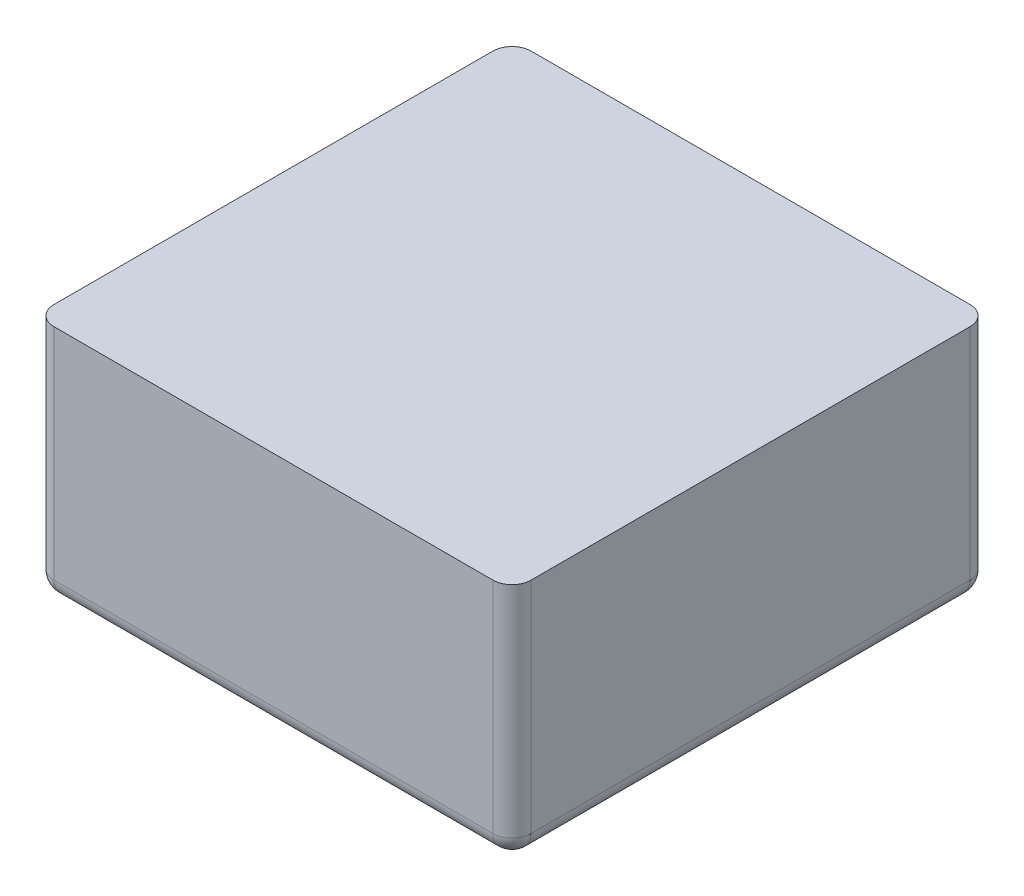
ISO-10303-21;
HEADER;
FILE_DESCRIPTION(('STEP AP214'),'2;1');
FILE_NAME('part.step','',(''),(''),'','','');
FILE_SCHEMA(('AUTOMOTIVE_DESIGN { 1 0 10303 214 1 1 1 1 }'));
ENDSEC;
DATA;
#1=APPLICATION_CONTEXT('core data for automotive mechanical design processes');
#2=APPLICATION_PROTOCOL_DEFINITION('international standard','automotive_design',2000,#1);
#3=PRODUCT_CONTEXT('',#1,'mechanical');
#4=PRODUCT('Part','Part','',(#3));
#5=PRODUCT_RELATED_PRODUCT_CATEGORY('part','',(#4));
#6=PRODUCT_DEFINITION_FORMATION('','',#4);
#7=PRODUCT_DEFINITION_CONTEXT('part definition',#1,'design');
#8=PRODUCT_DEFINITION('design','',#6,#7);
#9=PRODUCT_DEFINITION_SHAPE('','',#8);
#10=(LENGTH_UNIT() NAMED_UNIT(*) SI_UNIT(.MILLI.,.METRE.));
#11=(NAMED_UNIT(*) PLANE_ANGLE_UNIT() SI_UNIT($,.RADIAN.));
#12=(NAMED_UNIT(*) SI_UNIT($,.STERADIAN.) SOLID_ANGLE_UNIT());
#13=UNCERTAINTY_MEASURE_WITH_UNIT(LENGTH_MEASURE(1.E-05),#10,'distance_accuracy_value','');
#14=(GEOMETRIC_REPRESENTATION_CONTEXT(3) GLOBAL_UNCERTAINTY_ASSIGNED_CONTEXT((#13)) GLOBAL_UNIT_ASSIGNED_CONTEXT((#10,
#11,#12)) REPRESENTATION_CONTEXT('',''));
#15=CARTESIAN_POINT('',(0.,0.,0.));
#16=DIRECTION('',(0.,0.,1.));
#17=DIRECTION('',(1.,0.,0.));
#18=AXIS2_PLACEMENT_3D('',#15,#16,#17);
#19=CARTESIAN_POINT('',(-0.25,-0.5,-0.25));
#20=DIRECTION('',(0.,-1.,0.));
#21=DIRECTION('',(0.,0.,-1.));
#22=AXIS2_PLACEMENT_3D('',#19,#20,#21);
#23=PLANE('',#22);
#24=DIRECTION('',(0.,0.,1.));
#25=VECTOR('',#24,1.);
#26=CARTESIAN_POINT('',(0.23,-0.5,-0.25));
#27=LINE('',#26,#25);
#28=CARTESIAN_POINT('',(0.23,-0.5,0.23));
#29=VERTEX_POINT('',#28);
#30=CARTESIAN_POINT('',(0.23,-0.5,-0.23));
#31=VERTEX_POINT('',#30);
#32=EDGE_CURVE('E105',#29,#31,#27,.F.);
#33=ORIENTED_EDGE('',*,*,#32,.F.);
#34=DIRECTION('',(-1.,0.,0.));
#35=VECTOR('',#34,1.);
#36=CARTESIAN_POINT('',(-0.25,-0.5,0.23));
#37=LINE('',#36,#35);
#38=CARTESIAN_POINT('',(-0.23,-0.5,0.23));
#39=VERTEX_POINT('',#38);
#40=EDGE_CURVE('E100',#39,#29,#37,.F.);
#41=ORIENTED_EDGE('',*,*,#40,.F.);
#42=DIRECTION('',(0.,0.,-1.));
#43=VECTOR('',#42,1.);
#44=CARTESIAN_POINT('',(-0.23,-0.5,-0.25));
#45=LINE('',#44,#43);
#46=CARTESIAN_POINT('',(-0.23,-0.5,-0.23));
#47=VERTEX_POINT('',#46);
#48=EDGE_CURVE('E103',#47,#39,#45,.F.);
#49=ORIENTED_EDGE('',*,*,#48,.F.);
#50=DIRECTION('',(1.,0.,0.));
#51=VECTOR('',#50,1.);
#52=CARTESIAN_POINT('',(-0.25,-0.5,-0.23));
#53=LINE('',#52,#51);
#54=EDGE_CURVE('E167',#31,#47,#53,.F.);
#55=ORIENTED_EDGE('',*,*,#54,.F.);
#56=EDGE_LOOP('',(#33,#41,#49,#55));
#57=FACE_BOUND('',#56,.T.);
#58=ADVANCED_FACE('F16',(#57),#23,.T.);
#59=CARTESIAN_POINT('',(0.23,-0.48,0.23));
#60=DIRECTION('',(1.,0.,0.));
#61=DIRECTION('',(0.,1.,0.));
#62=AXIS2_PLACEMENT_3D('',#59,#60,#61);
#63=SPHERICAL_SURFACE('',#62,0.02);
#64=CARTESIAN_POINT('',(0.23,-0.48,0.23));
#65=DIRECTION('',(-1.,0.,0.));
#66=DIRECTION('',(0.,0.,1.));
#67=AXIS2_PLACEMENT_3D('',#64,#65,#66);
#68=CIRCLE('',#67,0.02);
#69=CARTESIAN_POINT('',(0.23,-0.48,0.25));
#70=VERTEX_POINT('',#69);
#71=EDGE_CURVE('E108',#29,#70,#68,.T.);
#72=ORIENTED_EDGE('',*,*,#71,.F.);
#73=CARTESIAN_POINT('',(0.23,-0.48,0.23));
#74=DIRECTION('',(0.,0.,1.));
#75=DIRECTION('',(1.,0.,0.));
#76=AXIS2_PLACEMENT_3D('',#73,#74,#75);
#77=CIRCLE('',#76,0.02);
#78=CARTESIAN_POINT('',(0.25,-0.48,0.23));
#79=VERTEX_POINT('',#78);
#80=EDGE_CURVE('E164',#79,#29,#77,.F.);
#81=ORIENTED_EDGE('',*,*,#80,.F.);
#82=CARTESIAN_POINT('',(0.23,-0.48,0.23));
#83=DIRECTION('',(0.,-1.,0.));
#84=DIRECTION('',(0.,0.,-1.));
#85=AXIS2_PLACEMENT_3D('',#82,#83,#84);
#86=CIRCLE('',#85,0.02);
#87=EDGE_CURVE('E230',#70,#79,#86,.F.);
#88=ORIENTED_EDGE('',*,*,#87,.F.);
#89=EDGE_LOOP('',(#72,#81,#88));
#90=FACE_BOUND('',#89,.T.);
#91=ADVANCED_FACE('F154',(#90),#63,.T.);
#92=CARTESIAN_POINT('',(-0.25,-0.48,0.23));
#93=DIRECTION('',(-1.,0.,0.));
#94=DIRECTION('',(0.,0.,1.));
#95=AXIS2_PLACEMENT_3D('',#92,#93,#94);
#96=CYLINDRICAL_SURFACE('',#95,0.02);
#97=ORIENTED_EDGE('',*,*,#71,.T.);
#98=DIRECTION('',(-1.,0.,0.));
#99=VECTOR('',#98,1.);
#100=CARTESIAN_POINT('',(0.25,-0.48,0.25));
#101=LINE('',#100,#99);
#102=CARTESIAN_POINT('',(-0.23,-0.48,0.25));
#103=VERTEX_POINT('',#102);
#104=EDGE_CURVE('E114',#70,#103,#101,.T.);
#105=ORIENTED_EDGE('',*,*,#104,.T.);
#106=CARTESIAN_POINT('',(-0.23,-0.48,0.23));
#107=DIRECTION('',(1.,0.,0.));
#108=DIRECTION('',(0.,1.,0.));
#109=AXIS2_PLACEMENT_3D('',#106,#107,#108);
#110=CIRCLE('',#109,0.02);
#111=EDGE_CURVE('E111',#39,#103,#110,.F.);
#112=ORIENTED_EDGE('',*,*,#111,.F.);
#113=ORIENTED_EDGE('',*,*,#40,.T.);
#114=EDGE_LOOP('',(#97,#105,#112,#113));
#115=FACE_BOUND('',#114,.T.);
#116=ADVANCED_FACE('F112',(#115),#96,.T.);
#117=CARTESIAN_POINT('',(-0.23,-0.48,0.23));
#118=DIRECTION('',(1.,0.,0.));
#119=DIRECTION('',(0.,1.,0.));
#120=AXIS2_PLACEMENT_3D('',#117,#118,#119);
#121=SPHERICAL_SURFACE('',#120,0.02);
#122=CARTESIAN_POINT('',(-0.23,-0.48,0.23));
#123=DIRECTION('',(0.,-1.,0.));
#124=DIRECTION('',(0.,0.,-1.));
#125=AXIS2_PLACEMENT_3D('',#122,#123,#124);
#126=CIRCLE('',#125,0.02);
#127=CARTESIAN_POINT('',(-0.25,-0.48,0.23));
#128=VERTEX_POINT('',#127);
#129=EDGE_CURVE('E129',#128,#103,#126,.F.);
#130=ORIENTED_EDGE('',*,*,#129,.F.);
#131=CARTESIAN_POINT('',(-0.23,-0.48,0.23));
#132=DIRECTION('',(0.,0.,-1.));
#133=DIRECTION('',(-1.,0.,0.));
#134=AXIS2_PLACEMENT_3D('',#131,#132,#133);
#135=CIRCLE('',#134,0.02);
#136=EDGE_CURVE('E120',#39,#128,#135,.T.);
#137=ORIENTED_EDGE('',*,*,#136,.F.);
#138=ORIENTED_EDGE('',*,*,#111,.T.);
#139=EDGE_LOOP('',(#130,#137,#138));
#140=FACE_BOUND('',#139,.T.);
#141=ADVANCED_FACE('F128',(#140),#121,.T.);
#142=CARTESIAN_POINT('',(-0.23,-0.48,-0.25));
#143=DIRECTION('',(0.,0.,-1.));
#144=DIRECTION('',(-1.,0.,0.));
#145=AXIS2_PLACEMENT_3D('',#142,#143,#144);
#146=CYLINDRICAL_SURFACE('',#145,0.02);
#147=CARTESIAN_POINT('',(-0.23,-0.48,-0.23));
#148=DIRECTION('',(0.,0.,-1.));
#149=DIRECTION('',(1.,0.,0.));
#150=AXIS2_PLACEMENT_3D('',#147,#148,#149);
#151=CIRCLE('',#150,0.02);
#152=CARTESIAN_POINT('',(-0.25,-0.48,-0.23));
#153=VERTEX_POINT('',#152);
#154=EDGE_CURVE('E125',#47,#153,#151,.T.);
#155=ORIENTED_EDGE('',*,*,#154,.F.);
#156=ORIENTED_EDGE('',*,*,#48,.T.);
#157=ORIENTED_EDGE('',*,*,#136,.T.);
#158=DIRECTION('',(0.,0.,-1.));
#159=VECTOR('',#158,1.);
#160=CARTESIAN_POINT('',(-0.25,-0.48,0.25));
#161=LINE('',#160,#159);
#162=EDGE_CURVE('E222',#128,#153,#161,.T.);
#163=ORIENTED_EDGE('',*,*,#162,.T.);
#164=EDGE_LOOP('',(#155,#156,#157,#163));
#165=FACE_BOUND('',#164,.T.);
#166=ADVANCED_FACE('F123',(#165),#146,.T.);
#167=CARTESIAN_POINT('',(-0.23,-0.48,-0.23));
#168=DIRECTION('',(1.,0.,0.));
#169=DIRECTION('',(0.,1.,0.));
#170=AXIS2_PLACEMENT_3D('',#167,#168,#169);
#171=SPHERICAL_SURFACE('',#170,0.02);
#172=CARTESIAN_POINT('',(-0.23,-0.48,-0.23));
#173=DIRECTION('',(0.,-1.,0.));
#174=DIRECTION('',(0.,0.,-1.));
#175=AXIS2_PLACEMENT_3D('',#172,#173,#174);
#176=CIRCLE('',#175,0.02);
#177=CARTESIAN_POINT('',(-0.23,-0.48,-0.25));
#178=VERTEX_POINT('',#177);
#179=EDGE_CURVE('E217',#178,#153,#176,.F.);
#180=ORIENTED_EDGE('',*,*,#179,.F.);
#181=CARTESIAN_POINT('',(-0.23,-0.48,-0.23));
#182=DIRECTION('',(1.,0.,0.));
#183=DIRECTION('',(0.,0.,-1.));
#184=AXIS2_PLACEMENT_3D('',#181,#182,#183);
#185=CIRCLE('',#184,0.02);
#186=EDGE_CURVE('E170',#47,#178,#185,.T.);
#187=ORIENTED_EDGE('',*,*,#186,.F.);
#188=ORIENTED_EDGE('',*,*,#154,.T.);
#189=EDGE_LOOP('',(#180,#187,#188));
#190=FACE_BOUND('',#189,.T.);
#191=ADVANCED_FACE('F266',(#190),#171,.T.);
#192=CARTESIAN_POINT('',(-0.25,-0.48,-0.23));
#193=DIRECTION('',(1.,0.,0.));
#194=DIRECTION('',(0.,0.,-1.));
#195=AXIS2_PLACEMENT_3D('',#192,#193,#194);
#196=CYLINDRICAL_SURFACE('',#195,0.02);
#197=CARTESIAN_POINT('',(0.23,-0.48,-0.23));
#198=DIRECTION('',(1.,0.,0.));
#199=DIRECTION('',(0.,1.,0.));
#200=AXIS2_PLACEMENT_3D('',#197,#198,#199);
#201=CIRCLE('',#200,0.02);
#202=CARTESIAN_POINT('',(0.23,-0.48,-0.25));
#203=VERTEX_POINT('',#202);
#204=EDGE_CURVE('E169',#31,#203,#201,.T.);
#205=ORIENTED_EDGE('',*,*,#204,.F.);
#206=ORIENTED_EDGE('',*,*,#54,.T.);
#207=ORIENTED_EDGE('',*,*,#186,.T.);
#208=DIRECTION('',(1.,0.,0.));
#209=VECTOR('',#208,1.);
#210=CARTESIAN_POINT('',(-0.25,-0.48,-0.25));
#211=LINE('',#210,#209);
#212=EDGE_CURVE('E212',#178,#203,#211,.T.);
#213=ORIENTED_EDGE('',*,*,#212,.T.);
#214=EDGE_LOOP('',(#205,#206,#207,#213));
#215=FACE_BOUND('',#214,.T.);
#216=ADVANCED_FACE('F262',(#215),#196,.T.);
#217=CARTESIAN_POINT('',(0.23,-0.48,-0.23));
#218=DIRECTION('',(1.,0.,0.));
#219=DIRECTION('',(0.,1.,0.));
#220=AXIS2_PLACEMENT_3D('',#217,#218,#219);
#221=SPHERICAL_SURFACE('',#220,0.02);
#222=ORIENTED_EDGE('',*,*,#204,.T.);
#223=CARTESIAN_POINT('',(0.23,-0.48,-0.23));
#224=DIRECTION('',(0.,-1.,0.));
#225=DIRECTION('',(0.,0.,-1.));
#226=AXIS2_PLACEMENT_3D('',#223,#224,#225);
#227=CIRCLE('',#226,0.02);
#228=CARTESIAN_POINT('',(0.25,-0.48,-0.23));
#229=VERTEX_POINT('',#228);
#230=EDGE_CURVE('E206',#229,#203,#227,.F.);
#231=ORIENTED_EDGE('',*,*,#230,.F.);
#232=CARTESIAN_POINT('',(0.23,-0.48,-0.23));
#233=DIRECTION('',(0.,0.,1.));
#234=DIRECTION('',(1.,0.,0.));
#235=AXIS2_PLACEMENT_3D('',#232,#233,#234);
#236=CIRCLE('',#235,0.02);
#237=EDGE_CURVE('E65',#31,#229,#236,.T.);
#238=ORIENTED_EDGE('',*,*,#237,.F.);
#239=EDGE_LOOP('',(#222,#231,#238));
#240=FACE_BOUND('',#239,.T.);
#241=ADVANCED_FACE('F257',(#240),#221,.T.);
#242=CARTESIAN_POINT('',(0.23,-0.48,-0.25));
#243=DIRECTION('',(0.,0.,1.));
#244=DIRECTION('',(1.,0.,0.));
#245=AXIS2_PLACEMENT_3D('',#242,#243,#244);
#246=CYLINDRICAL_SURFACE('',#245,0.02);
#247=ORIENTED_EDGE('',*,*,#237,.T.);
#248=DIRECTION('',(0.,0.,1.));
#249=VECTOR('',#248,1.);
#250=CARTESIAN_POINT('',(0.25,-0.48,-0.25));
#251=LINE('',#250,#249);
#252=EDGE_CURVE('E194',#229,#79,#251,.T.);
#253=ORIENTED_EDGE('',*,*,#252,.T.);
#254=ORIENTED_EDGE('',*,*,#80,.T.);
#255=ORIENTED_EDGE('',*,*,#32,.T.);
#256=EDGE_LOOP('',(#247,#253,#254,#255));
#257=FACE_BOUND('',#256,.T.);
#258=ADVANCED_FACE('F261',(#257),#246,.T.);
#259=CARTESIAN_POINT('',(0.23,-0.5,0.23));
#260=DIRECTION('',(0.,-1.,0.));
#261=DIRECTION('',(0.,0.,-1.));
#262=AXIS2_PLACEMENT_3D('',#259,#260,#261);
#263=CYLINDRICAL_SURFACE('',#262,0.02);
#264=ORIENTED_EDGE('',*,*,#87,.T.);
#265=DIRECTION('',(0.,1.,0.));
#266=VECTOR('',#265,1.);
#267=CARTESIAN_POINT('',(0.25,-0.5,0.23));
#268=LINE('',#267,#266);
#269=CARTESIAN_POINT('',(0.25,-0.25,0.23));
#270=VERTEX_POINT('',#269);
#271=EDGE_CURVE('E198',#79,#270,#268,.T.);
#272=ORIENTED_EDGE('',*,*,#271,.T.);
#273=CARTESIAN_POINT('',(0.23,-0.25,0.23));
#274=DIRECTION('',(0.,-1.,0.));
#275=DIRECTION('',(0.,0.,-1.));
#276=AXIS2_PLACEMENT_3D('',#273,#274,#275);
#277=CIRCLE('',#276,0.02);
#278=CARTESIAN_POINT('',(0.23,-0.25,0.25));
#279=VERTEX_POINT('',#278);
#280=EDGE_CURVE('E19',#270,#279,#277,.T.);
#281=ORIENTED_EDGE('',*,*,#280,.T.);
#282=DIRECTION('',(0.,1.,0.));
#283=VECTOR('',#282,1.);
#284=CARTESIAN_POINT('',(0.23,-0.5,0.25));
#285=LINE('',#284,#283);
#286=EDGE_CURVE('E143',#279,#70,#285,.F.);
#287=ORIENTED_EDGE('',*,*,#286,.T.);
#288=EDGE_LOOP('',(#264,#272,#281,#287));
#289=FACE_BOUND('',#288,.T.);
#290=ADVANCED_FACE('F373',(#289),#263,.T.);
#291=CARTESIAN_POINT('',(0.25,-0.5,0.25));
#292=DIRECTION('',(0.,0.,-1.));
#293=DIRECTION('',(-1.,0.,0.));
#294=AXIS2_PLACEMENT_3D('',#291,#292,#293);
#295=PLANE('',#294);
#296=ORIENTED_EDGE('',*,*,#286,.F.);
#297=DIRECTION('',(1.,0.,0.));
#298=VECTOR('',#297,1.);
#299=CARTESIAN_POINT('',(-0.25,-0.25,0.25));
#300=LINE('',#299,#298);
#301=CARTESIAN_POINT('',(-0.23,-0.25,0.25));
#302=VERTEX_POINT('',#301);
#303=EDGE_CURVE('E185',#279,#302,#300,.F.);
#304=ORIENTED_EDGE('',*,*,#303,.T.);
#305=DIRECTION('',(0.,-1.,0.));
#306=VECTOR('',#305,1.);
#307=CARTESIAN_POINT('',(-0.23,-0.5,0.25));
#308=LINE('',#307,#306);
#309=EDGE_CURVE('E139',#103,#302,#308,.F.);
#310=ORIENTED_EDGE('',*,*,#309,.F.);
#311=ORIENTED_EDGE('',*,*,#104,.F.);
#312=EDGE_LOOP('',(#296,#304,#310,#311));
#313=FACE_BOUND('',#312,.T.);
#314=ADVANCED_FACE('F364',(#313),#295,.F.);
#315=CARTESIAN_POINT('',(-0.23,-0.5,0.23));
#316=DIRECTION('',(0.,-1.,0.));
#317=DIRECTION('',(0.,0.,-1.));
#318=AXIS2_PLACEMENT_3D('',#315,#316,#317);
#319=CYLINDRICAL_SURFACE('',#318,0.02);
#320=CARTESIAN_POINT('',(-0.23,-0.25,0.23));
#321=DIRECTION('',(0.,-1.,0.));
#322=DIRECTION('',(0.,0.,-1.));
#323=AXIS2_PLACEMENT_3D('',#320,#321,#322);
#324=CIRCLE('',#323,0.02);
#325=CARTESIAN_POINT('',(-0.25,-0.25,0.23));
#326=VERTEX_POINT('',#325);
#327=EDGE_CURVE('E183',#302,#326,#324,.T.);
#328=ORIENTED_EDGE('',*,*,#327,.T.);
#329=DIRECTION('',(0.,1.,0.));
#330=VECTOR('',#329,1.);
#331=CARTESIAN_POINT('',(-0.25,-0.5,0.23));
#332=LINE('',#331,#330);
#333=EDGE_CURVE('E220',#326,#128,#332,.F.);
#334=ORIENTED_EDGE('',*,*,#333,.T.);
#335=ORIENTED_EDGE('',*,*,#129,.T.);
#336=ORIENTED_EDGE('',*,*,#309,.T.);
#337=EDGE_LOOP('',(#328,#334,#335,#336));
#338=FACE_BOUND('',#337,.T.);
#339=ADVANCED_FACE('F355',(#338),#319,.T.);
#340=CARTESIAN_POINT('',(-0.25,-0.5,0.25));
#341=DIRECTION('',(1.,0.,0.));
#342=DIRECTION('',(0.,0.,-1.));
#343=AXIS2_PLACEMENT_3D('',#340,#341,#342);
#344=PLANE('',#343);
#345=DIRECTION('',(0.,-1.,0.));
#346=VECTOR('',#345,1.);
#347=CARTESIAN_POINT('',(-0.25,-0.5,-0.23));
#348=LINE('',#347,#346);
#349=CARTESIAN_POINT('',(-0.25,-0.25,-0.23));
#350=VERTEX_POINT('',#349);
#351=EDGE_CURVE('E213',#153,#350,#348,.F.);
#352=ORIENTED_EDGE('',*,*,#351,.F.);
#353=ORIENTED_EDGE('',*,*,#162,.F.);
#354=ORIENTED_EDGE('',*,*,#333,.F.);
#355=DIRECTION('',(0.,0.,-1.));
#356=VECTOR('',#355,1.);
#357=CARTESIAN_POINT('',(-0.25,-0.25,-0.25));
#358=LINE('',#357,#356);
#359=EDGE_CURVE('E182',#326,#350,#358,.T.);
#360=ORIENTED_EDGE('',*,*,#359,.T.);
#361=EDGE_LOOP('',(#352,#353,#354,#360));
#362=FACE_BOUND('',#361,.T.);
#363=ADVANCED_FACE('F287',(#362),#344,.F.);
#364=CARTESIAN_POINT('',(-0.23,-0.5,-0.23));
#365=DIRECTION('',(0.,-1.,0.));
#366=DIRECTION('',(0.,0.,-1.));
#367=AXIS2_PLACEMENT_3D('',#364,#365,#366);
#368=CYLINDRICAL_SURFACE('',#367,0.02);
#369=ORIENTED_EDGE('',*,*,#179,.T.);
#370=ORIENTED_EDGE('',*,*,#351,.T.);
#371=CARTESIAN_POINT('',(-0.23,-0.25,-0.23));
#372=DIRECTION('',(0.,-1.,0.));
#373=DIRECTION('',(0.,0.,-1.));
#374=AXIS2_PLACEMENT_3D('',#371,#372,#373);
#375=CIRCLE('',#374,0.02);
#376=CARTESIAN_POINT('',(-0.23,-0.25,-0.25));
#377=VERTEX_POINT('',#376);
#378=EDGE_CURVE('E180',#350,#377,#375,.T.);
#379=ORIENTED_EDGE('',*,*,#378,.T.);
#380=DIRECTION('',(0.,1.,0.));
#381=VECTOR('',#380,1.);
#382=CARTESIAN_POINT('',(-0.23,-0.5,-0.25));
#383=LINE('',#382,#381);
#384=EDGE_CURVE('E209',#377,#178,#383,.F.);
#385=ORIENTED_EDGE('',*,*,#384,.T.);
#386=EDGE_LOOP('',(#369,#370,#379,#385));
#387=FACE_BOUND('',#386,.T.);
#388=ADVANCED_FACE('F291',(#387),#368,.T.);
#389=CARTESIAN_POINT('',(-0.25,-0.5,-0.25));
#390=DIRECTION('',(0.,0.,1.));
#391=DIRECTION('',(1.,0.,0.));
#392=AXIS2_PLACEMENT_3D('',#389,#390,#391);
#393=PLANE('',#392);
#394=DIRECTION('',(0.,-1.,0.));
#395=VECTOR('',#394,1.);
#396=CARTESIAN_POINT('',(0.23,-0.5,-0.25));
#397=LINE('',#396,#395);
#398=CARTESIAN_POINT('',(0.23,-0.25,-0.25));
#399=VERTEX_POINT('',#398);
#400=EDGE_CURVE('E202',#203,#399,#397,.F.);
#401=ORIENTED_EDGE('',*,*,#400,.F.);
#402=ORIENTED_EDGE('',*,*,#212,.F.);
#403=ORIENTED_EDGE('',*,*,#384,.F.);
#404=DIRECTION('',(1.,0.,0.));
#405=VECTOR('',#404,1.);
#406=CARTESIAN_POINT('',(-0.25,-0.25,-0.25));
#407=LINE('',#406,#405);
#408=EDGE_CURVE('E179',#377,#399,#407,.T.);
#409=ORIENTED_EDGE('',*,*,#408,.T.);
#410=EDGE_LOOP('',(#401,#402,#403,#409));
#411=FACE_BOUND('',#410,.T.);
#412=ADVANCED_FACE('F298',(#411),#393,.F.);
#413=CARTESIAN_POINT('',(0.23,-0.5,-0.23));
#414=DIRECTION('',(0.,-1.,0.));
#415=DIRECTION('',(0.,0.,-1.));
#416=AXIS2_PLACEMENT_3D('',#413,#414,#415);
#417=CYLINDRICAL_SURFACE('',#416,0.02);
#418=CARTESIAN_POINT('',(0.23,-0.25,-0.23));
#419=DIRECTION('',(0.,-1.,0.));
#420=DIRECTION('',(0.,0.,-1.));
#421=AXIS2_PLACEMENT_3D('',#418,#419,#420);
#422=CIRCLE('',#421,0.02);
#423=CARTESIAN_POINT('',(0.25,-0.25,-0.23));
#424=VERTEX_POINT('',#423);
#425=EDGE_CURVE('E25',#399,#424,#422,.T.);
#426=ORIENTED_EDGE('',*,*,#425,.T.);
#427=DIRECTION('',(0.,1.,0.));
#428=VECTOR('',#427,1.);
#429=CARTESIAN_POINT('',(0.25,-0.5,-0.23));
#430=LINE('',#429,#428);
#431=EDGE_CURVE('E33',#424,#229,#430,.F.);
#432=ORIENTED_EDGE('',*,*,#431,.T.);
#433=ORIENTED_EDGE('',*,*,#230,.T.);
#434=ORIENTED_EDGE('',*,*,#400,.T.);
#435=EDGE_LOOP('',(#426,#432,#433,#434));
#436=FACE_BOUND('',#435,.T.);
#437=ADVANCED_FACE('F305',(#436),#417,.T.);
#438=CARTESIAN_POINT('',(0.25,-0.5,-0.25));
#439=DIRECTION('',(-1.,0.,0.));
#440=DIRECTION('',(0.,0.,1.));
#441=AXIS2_PLACEMENT_3D('',#438,#439,#440);
#442=PLANE('',#441);
#443=ORIENTED_EDGE('',*,*,#431,.F.);
#444=DIRECTION('',(0.,0.,-1.));
#445=VECTOR('',#444,1.);
#446=CARTESIAN_POINT('',(0.25,-0.25,-0.25));
#447=LINE('',#446,#445);
#448=EDGE_CURVE('E11',#424,#270,#447,.F.);
#449=ORIENTED_EDGE('',*,*,#448,.T.);
#450=ORIENTED_EDGE('',*,*,#271,.F.);
#451=ORIENTED_EDGE('',*,*,#252,.F.);
#452=EDGE_LOOP('',(#443,#449,#450,#451));
#453=FACE_BOUND('',#452,.T.);
#454=ADVANCED_FACE('F303',(#453),#442,.F.);
#455=CARTESIAN_POINT('',(-0.25,-0.25,-0.25));
#456=DIRECTION('',(0.,-1.,0.));
#457=DIRECTION('',(0.,0.,-1.));
#458=AXIS2_PLACEMENT_3D('',#455,#456,#457);
#459=PLANE('',#458);
#460=ORIENTED_EDGE('',*,*,#425,.F.);
#461=ORIENTED_EDGE('',*,*,#408,.F.);
#462=ORIENTED_EDGE('',*,*,#378,.F.);
#463=ORIENTED_EDGE('',*,*,#359,.F.);
#464=ORIENTED_EDGE('',*,*,#327,.F.);
#465=ORIENTED_EDGE('',*,*,#303,.F.);
#466=ORIENTED_EDGE('',*,*,#280,.F.);
#467=ORIENTED_EDGE('',*,*,#448,.F.);
#468=EDGE_LOOP('',(#460,#461,#462,#463,#464,#465,#466,#467));
#469=FACE_BOUND('',#468,.T.);
#470=ADVANCED_FACE('F294',(#469),#459,.F.);
#471=CLOSED_SHELL('',(#58,#91,#116,#141,#166,#191,#216,#241,#258,#290,#314,#339,#363,#388,#412,
#437,#454,#470));
#472=MANIFOLD_SOLID_BREP('B1',#471);
#473=ADVANCED_BREP_SHAPE_REPRESENTATION('',(#18,#472),#14);
#474=SHAPE_DEFINITION_REPRESENTATION(#9,#473);
ENDSEC;
END-ISO-10303-21;
